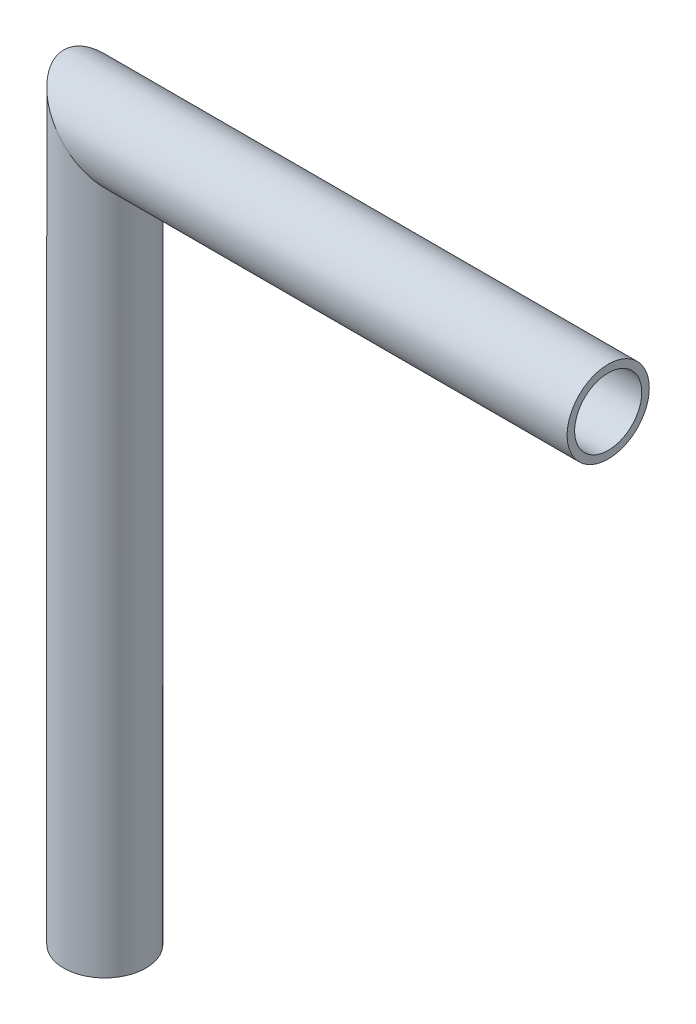
ISO-10303-21;
HEADER;
FILE_DESCRIPTION(('STEP AP214'),'2;1');
FILE_NAME('part.step','',(''),(''),'','','');
FILE_SCHEMA(('AUTOMOTIVE_DESIGN { 1 0 10303 214 1 1 1 1 }'));
ENDSEC;
DATA;
#1=APPLICATION_CONTEXT('core data for automotive mechanical design processes');
#2=APPLICATION_PROTOCOL_DEFINITION('international standard','automotive_design',2000,#1);
#3=PRODUCT_CONTEXT('',#1,'mechanical');
#4=PRODUCT('Part','Part','',(#3));
#5=PRODUCT_RELATED_PRODUCT_CATEGORY('part','',(#4));
#6=PRODUCT_DEFINITION_FORMATION('','',#4);
#7=PRODUCT_DEFINITION_CONTEXT('part definition',#1,'design');
#8=PRODUCT_DEFINITION('design','',#6,#7);
#9=PRODUCT_DEFINITION_SHAPE('','',#8);
#10=(LENGTH_UNIT() NAMED_UNIT(*) SI_UNIT(.MILLI.,.METRE.));
#11=(NAMED_UNIT(*) PLANE_ANGLE_UNIT() SI_UNIT($,.RADIAN.));
#12=(NAMED_UNIT(*) SI_UNIT($,.STERADIAN.) SOLID_ANGLE_UNIT());
#13=UNCERTAINTY_MEASURE_WITH_UNIT(LENGTH_MEASURE(1.E-05),#10,'distance_accuracy_value','');
#14=(GEOMETRIC_REPRESENTATION_CONTEXT(3) GLOBAL_UNCERTAINTY_ASSIGNED_CONTEXT((#13)) GLOBAL_UNIT_ASSIGNED_CONTEXT((#10,
#11,#12)) REPRESENTATION_CONTEXT('',''));
#15=CARTESIAN_POINT('',(0.,0.,0.));
#16=DIRECTION('',(0.,0.,1.));
#17=DIRECTION('',(1.,0.,0.));
#18=AXIS2_PLACEMENT_3D('',#15,#16,#17);
#19=CARTESIAN_POINT('',(0.,170.,0.));
#20=DIRECTION('',(0.,-1.,0.));
#21=DIRECTION('',(0.,0.,-1.));
#22=AXIS2_PLACEMENT_3D('',#19,#20,#21);
#23=CYLINDRICAL_SURFACE('',#22,9.79031917063367);
#24=CARTESIAN_POINT('',(0.,170.,0.));
#25=DIRECTION('',(-0.707106781186548,-0.707106781186548,0.));
#26=DIRECTION('',(0.707106781186548,-0.707106781186548,0.));
#27=AXIS2_PLACEMENT_3D('',#24,#25,#26);
#28=ELLIPSE('',#27,13.8456021510714,9.79031917063367);
#29=CARTESIAN_POINT('',(9.79031917063367,160.209680829366,0.));
#30=VERTEX_POINT('',#29);
#31=EDGE_CURVE('E57',#30,#30,#28,.F.);
#32=ORIENTED_EDGE('',*,*,#31,.F.);
#33=EDGE_LOOP('',(#32));
#34=FACE_BOUND('',#33,.T.);
#35=CARTESIAN_POINT('',(0.,0.,0.));
#36=DIRECTION('',(0.,-1.,0.));
#37=DIRECTION('',(0.,0.,-1.));
#38=AXIS2_PLACEMENT_3D('',#35,#36,#37);
#39=CIRCLE('',#38,9.79031917063367);
#40=CARTESIAN_POINT('',(0.,0.,-9.79031917063367));
#41=VERTEX_POINT('',#40);
#42=EDGE_CURVE('E13',#41,#41,#39,.T.);
#43=ORIENTED_EDGE('',*,*,#42,.F.);
#44=EDGE_LOOP('',(#43));
#45=FACE_BOUND('',#44,.T.);
#46=ADVANCED_FACE('F41',(#34,#45),#23,.T.);
#47=CARTESIAN_POINT('',(0.,170.,0.));
#48=DIRECTION('',(0.,-1.,0.));
#49=DIRECTION('',(0.,0.,-1.));
#50=AXIS2_PLACEMENT_3D('',#47,#48,#49);
#51=CYLINDRICAL_SURFACE('',#50,8.);
#52=CARTESIAN_POINT('',(0.,170.,0.));
#53=DIRECTION('',(-0.707106781186548,-0.707106781186548,0.));
#54=DIRECTION('',(0.707106781186548,-0.707106781186548,0.));
#55=AXIS2_PLACEMENT_3D('',#52,#53,#54);
#56=ELLIPSE('',#55,11.3137084989848,8.);
#57=CARTESIAN_POINT('',(8.,162.,0.));
#58=VERTEX_POINT('',#57);
#59=EDGE_CURVE('E53',#58,#58,#56,.F.);
#60=ORIENTED_EDGE('',*,*,#59,.T.);
#61=EDGE_LOOP('',(#60));
#62=FACE_BOUND('',#61,.T.);
#63=CARTESIAN_POINT('',(0.,0.,0.));
#64=DIRECTION('',(0.,-1.,0.));
#65=DIRECTION('',(0.,0.,-1.));
#66=AXIS2_PLACEMENT_3D('',#63,#64,#65);
#67=CIRCLE('',#66,8.);
#68=CARTESIAN_POINT('',(0.,0.,-8.));
#69=VERTEX_POINT('',#68);
#70=EDGE_CURVE('E45',#69,#69,#67,.T.);
#71=ORIENTED_EDGE('',*,*,#70,.T.);
#72=EDGE_LOOP('',(#71));
#73=FACE_BOUND('',#72,.T.);
#74=ADVANCED_FACE('F43',(#62,#73),#51,.F.);
#75=CARTESIAN_POINT('',(-27.6912043021429,170.,0.));
#76=DIRECTION('',(1.,0.,0.));
#77=DIRECTION('',(0.,0.,-1.));
#78=AXIS2_PLACEMENT_3D('',#75,#76,#77);
#79=CYLINDRICAL_SURFACE('',#78,8.);
#80=CARTESIAN_POINT('',(120.,170.,0.));
#81=DIRECTION('',(1.,0.,0.));
#82=DIRECTION('',(0.,0.,-1.));
#83=AXIS2_PLACEMENT_3D('',#80,#81,#82);
#84=CIRCLE('',#83,8.);
#85=CARTESIAN_POINT('',(120.,170.,-8.));
#86=VERTEX_POINT('',#85);
#87=EDGE_CURVE('E58',#86,#86,#84,.T.);
#88=ORIENTED_EDGE('',*,*,#87,.T.);
#89=EDGE_LOOP('',(#88));
#90=FACE_BOUND('',#89,.T.);
#91=ORIENTED_EDGE('',*,*,#59,.F.);
#92=EDGE_LOOP('',(#91));
#93=FACE_BOUND('',#92,.T.);
#94=ADVANCED_FACE('F73',(#90,#93),#79,.F.);
#95=CARTESIAN_POINT('',(120.,170.,0.));
#96=DIRECTION('',(1.,0.,0.));
#97=DIRECTION('',(0.,0.,-1.));
#98=AXIS2_PLACEMENT_3D('',#95,#96,#97);
#99=PLANE('',#98);
#100=ORIENTED_EDGE('',*,*,#87,.F.);
#101=EDGE_LOOP('',(#100));
#102=FACE_BOUND('',#101,.T.);
#103=CARTESIAN_POINT('',(120.,170.,0.));
#104=DIRECTION('',(1.,0.,0.));
#105=DIRECTION('',(0.,0.,-1.));
#106=AXIS2_PLACEMENT_3D('',#103,#104,#105);
#107=CIRCLE('',#106,9.79031917063367);
#108=CARTESIAN_POINT('',(120.,170.,-9.79031917063367));
#109=VERTEX_POINT('',#108);
#110=EDGE_CURVE('E61',#109,#109,#107,.T.);
#111=ORIENTED_EDGE('',*,*,#110,.T.);
#112=EDGE_LOOP('',(#111));
#113=FACE_BOUND('',#112,.T.);
#114=ADVANCED_FACE('F78',(#102,#113),#99,.T.);
#115=CARTESIAN_POINT('',(-27.6912043021429,170.,0.));
#116=DIRECTION('',(1.,0.,0.));
#117=DIRECTION('',(0.,0.,-1.));
#118=AXIS2_PLACEMENT_3D('',#115,#116,#117);
#119=CYLINDRICAL_SURFACE('',#118,9.79031917063367);
#120=ORIENTED_EDGE('',*,*,#110,.F.);
#121=EDGE_LOOP('',(#120));
#122=FACE_BOUND('',#121,.T.);
#123=ORIENTED_EDGE('',*,*,#31,.T.);
#124=EDGE_LOOP('',(#123));
#125=FACE_BOUND('',#124,.T.);
#126=ADVANCED_FACE('F66',(#122,#125),#119,.T.);
#127=CARTESIAN_POINT('',(0.,0.,0.));
#128=DIRECTION('',(0.,-1.,0.));
#129=DIRECTION('',(0.,0.,-1.));
#130=AXIS2_PLACEMENT_3D('',#127,#128,#129);
#131=PLANE('',#130);
#132=ORIENTED_EDGE('',*,*,#70,.F.);
#133=EDGE_LOOP('',(#132));
#134=FACE_BOUND('',#133,.T.);
#135=ORIENTED_EDGE('',*,*,#42,.T.);
#136=EDGE_LOOP('',(#135));
#137=FACE_BOUND('',#136,.T.);
#138=ADVANCED_FACE('F82',(#134,#137),#131,.T.);
#139=CLOSED_SHELL('',(#46,#74,#94,#114,#126,#138));
#140=MANIFOLD_SOLID_BREP('B2',#139);
#141=ADVANCED_BREP_SHAPE_REPRESENTATION('',(#18,#140),#14);
#142=SHAPE_DEFINITION_REPRESENTATION(#9,#141);
ENDSEC;
END-ISO-10303-21;
